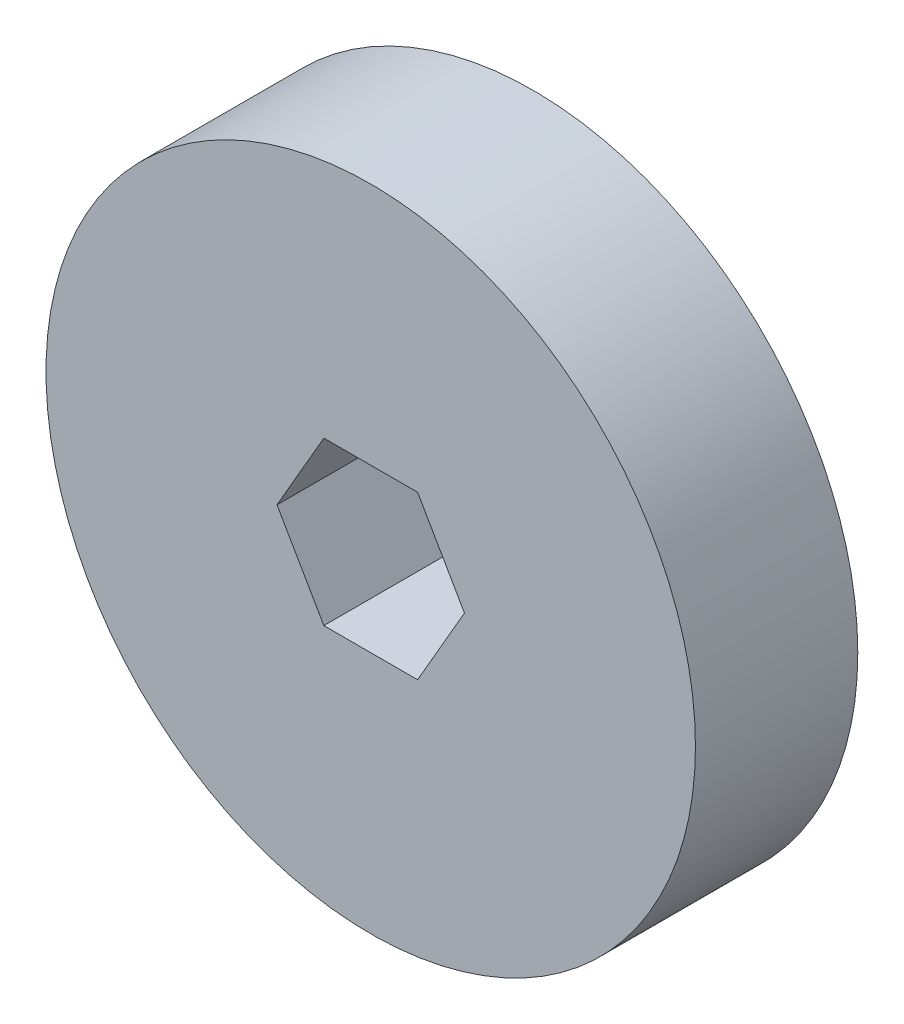
ISO-10303-21;
HEADER;
FILE_DESCRIPTION(('STEP AP214'),'2;1');
FILE_NAME('part.step','',(''),(''),'','','');
FILE_SCHEMA(('AUTOMOTIVE_DESIGN { 1 0 10303 214 1 1 1 1 }'));
ENDSEC;
DATA;
#1=APPLICATION_CONTEXT('core data for automotive mechanical design processes');
#2=APPLICATION_PROTOCOL_DEFINITION('international standard','automotive_design',2000,#1);
#3=PRODUCT_CONTEXT('',#1,'mechanical');
#4=PRODUCT('Part','Part','',(#3));
#5=PRODUCT_RELATED_PRODUCT_CATEGORY('part','',(#4));
#6=PRODUCT_DEFINITION_FORMATION('','',#4);
#7=PRODUCT_DEFINITION_CONTEXT('part definition',#1,'design');
#8=PRODUCT_DEFINITION('design','',#6,#7);
#9=PRODUCT_DEFINITION_SHAPE('','',#8);
#10=(LENGTH_UNIT() NAMED_UNIT(*) SI_UNIT(.MILLI.,.METRE.));
#11=(NAMED_UNIT(*) PLANE_ANGLE_UNIT() SI_UNIT($,.RADIAN.));
#12=(NAMED_UNIT(*) SI_UNIT($,.STERADIAN.) SOLID_ANGLE_UNIT());
#13=UNCERTAINTY_MEASURE_WITH_UNIT(LENGTH_MEASURE(1.E-05),#10,'distance_accuracy_value','');
#14=(GEOMETRIC_REPRESENTATION_CONTEXT(3) GLOBAL_UNCERTAINTY_ASSIGNED_CONTEXT((#13)) GLOBAL_UNIT_ASSIGNED_CONTEXT((#10,
#11,#12)) REPRESENTATION_CONTEXT('',''));
#15=CARTESIAN_POINT('',(0.,0.,0.));
#16=DIRECTION('',(0.,0.,1.));
#17=DIRECTION('',(1.,0.,0.));
#18=AXIS2_PLACEMENT_3D('',#15,#16,#17);
#19=CARTESIAN_POINT('',(0.,0.,12.7));
#20=DIRECTION('',(0.,0.,-1.));
#21=DIRECTION('',(-1.,0.,0.));
#22=AXIS2_PLACEMENT_3D('',#19,#20,#21);
#23=CYLINDRICAL_SURFACE('',#22,25.4);
#24=CARTESIAN_POINT('',(0.,0.,12.7));
#25=DIRECTION('',(0.,0.,1.));
#26=DIRECTION('',(1.,0.,0.));
#27=AXIS2_PLACEMENT_3D('',#24,#25,#26);
#28=CIRCLE('',#27,25.4);
#29=CARTESIAN_POINT('',(25.4,0.,12.7));
#30=VERTEX_POINT('',#29);
#31=EDGE_CURVE('E11',#30,#30,#28,.T.);
#32=ORIENTED_EDGE('',*,*,#31,.F.);
#33=EDGE_LOOP('',(#32));
#34=FACE_BOUND('',#33,.T.);
#35=CARTESIAN_POINT('',(0.,0.,0.));
#36=DIRECTION('',(0.,0.,1.));
#37=DIRECTION('',(1.,0.,0.));
#38=AXIS2_PLACEMENT_3D('',#35,#36,#37);
#39=CIRCLE('',#38,25.4);
#40=CARTESIAN_POINT('',(25.4,0.,0.));
#41=VERTEX_POINT('',#40);
#42=EDGE_CURVE('E50',#41,#41,#39,.T.);
#43=ORIENTED_EDGE('',*,*,#42,.T.);
#44=EDGE_LOOP('',(#43));
#45=FACE_BOUND('',#44,.T.);
#46=ADVANCED_FACE('F47',(#34,#45),#23,.T.);
#47=CARTESIAN_POINT('',(0.,0.,12.7));
#48=DIRECTION('',(0.,0.,1.));
#49=DIRECTION('',(1.,0.,0.));
#50=AXIS2_PLACEMENT_3D('',#47,#48,#49);
#51=PLANE('',#50);
#52=DIRECTION('',(0.5,0.866025403784439,0.));
#53=VECTOR('',#52,1.);
#54=CARTESIAN_POINT('',(3.66617420935412,-6.35,12.7));
#55=LINE('',#54,#53);
#56=CARTESIAN_POINT('',(3.66617420935412,-6.35,12.7));
#57=VERTEX_POINT('',#56);
#58=CARTESIAN_POINT('',(7.33234841870825,0.,12.7));
#59=VERTEX_POINT('',#58);
#60=EDGE_CURVE('E62',#57,#59,#55,.T.);
#61=ORIENTED_EDGE('',*,*,#60,.F.);
#62=DIRECTION('',(1.,0.,0.));
#63=VECTOR('',#62,1.);
#64=CARTESIAN_POINT('',(-3.66617420935412,-6.35,12.7));
#65=LINE('',#64,#63);
#66=CARTESIAN_POINT('',(-3.66617420935412,-6.35,12.7));
#67=VERTEX_POINT('',#66);
#68=EDGE_CURVE('E122',#67,#57,#65,.T.);
#69=ORIENTED_EDGE('',*,*,#68,.F.);
#70=DIRECTION('',(0.5,-0.866025403784439,0.));
#71=VECTOR('',#70,1.);
#72=CARTESIAN_POINT('',(-7.33234841870824,0.,12.7));
#73=LINE('',#72,#71);
#74=CARTESIAN_POINT('',(-7.33234841870824,0.,12.7));
#75=VERTEX_POINT('',#74);
#76=EDGE_CURVE('E126',#75,#67,#73,.T.);
#77=ORIENTED_EDGE('',*,*,#76,.F.);
#78=DIRECTION('',(-0.5,-0.866025403784439,0.));
#79=VECTOR('',#78,1.);
#80=CARTESIAN_POINT('',(-3.66617420935412,6.35,12.7));
#81=LINE('',#80,#79);
#82=CARTESIAN_POINT('',(-3.66617420935412,6.35,12.7));
#83=VERTEX_POINT('',#82);
#84=EDGE_CURVE('E149',#83,#75,#81,.T.);
#85=ORIENTED_EDGE('',*,*,#84,.F.);
#86=DIRECTION('',(-1.,0.,0.));
#87=VECTOR('',#86,1.);
#88=CARTESIAN_POINT('',(3.66617420935412,6.35,12.7));
#89=LINE('',#88,#87);
#90=CARTESIAN_POINT('',(3.66617420935412,6.35,12.7));
#91=VERTEX_POINT('',#90);
#92=EDGE_CURVE('E145',#91,#83,#89,.T.);
#93=ORIENTED_EDGE('',*,*,#92,.F.);
#94=DIRECTION('',(-0.5,0.866025403784439,0.));
#95=VECTOR('',#94,1.);
#96=CARTESIAN_POINT('',(7.33234841870825,0.,12.7));
#97=LINE('',#96,#95);
#98=EDGE_CURVE('E142',#59,#91,#97,.T.);
#99=ORIENTED_EDGE('',*,*,#98,.F.);
#100=EDGE_LOOP('',(#61,#69,#77,#85,#93,#99));
#101=FACE_BOUND('',#100,.T.);
#102=ORIENTED_EDGE('',*,*,#31,.T.);
#103=EDGE_LOOP('',(#102));
#104=FACE_BOUND('',#103,.T.);
#105=ADVANCED_FACE('F173',(#101,#104),#51,.T.);
#106=CARTESIAN_POINT('',(0.,0.,0.));
#107=DIRECTION('',(0.,0.,1.));
#108=DIRECTION('',(1.,0.,0.));
#109=AXIS2_PLACEMENT_3D('',#106,#107,#108);
#110=PLANE('',#109);
#111=DIRECTION('',(1.,0.,0.));
#112=VECTOR('',#111,1.);
#113=CARTESIAN_POINT('',(-3.66617420935412,-6.35,0.));
#114=LINE('',#113,#112);
#115=CARTESIAN_POINT('',(-3.66617420935412,-6.35,0.));
#116=VERTEX_POINT('',#115);
#117=CARTESIAN_POINT('',(3.66617420935412,-6.35,0.));
#118=VERTEX_POINT('',#117);
#119=EDGE_CURVE('E109',#116,#118,#114,.T.);
#120=ORIENTED_EDGE('',*,*,#119,.T.);
#121=DIRECTION('',(0.5,0.866025403784439,0.));
#122=VECTOR('',#121,1.);
#123=CARTESIAN_POINT('',(3.66617420935412,-6.35,0.));
#124=LINE('',#123,#122);
#125=CARTESIAN_POINT('',(7.33234841870825,0.,0.));
#126=VERTEX_POINT('',#125);
#127=EDGE_CURVE('E102',#118,#126,#124,.T.);
#128=ORIENTED_EDGE('',*,*,#127,.T.);
#129=DIRECTION('',(-0.5,0.866025403784439,0.));
#130=VECTOR('',#129,1.);
#131=CARTESIAN_POINT('',(7.33234841870825,0.,0.));
#132=LINE('',#131,#130);
#133=CARTESIAN_POINT('',(3.66617420935413,6.35,0.));
#134=VERTEX_POINT('',#133);
#135=EDGE_CURVE('E112',#126,#134,#132,.T.);
#136=ORIENTED_EDGE('',*,*,#135,.T.);
#137=DIRECTION('',(-1.,0.,0.));
#138=VECTOR('',#137,1.);
#139=CARTESIAN_POINT('',(3.66617420935412,6.35,0.));
#140=LINE('',#139,#138);
#141=CARTESIAN_POINT('',(-3.66617420935412,6.35,0.));
#142=VERTEX_POINT('',#141);
#143=EDGE_CURVE('E70',#134,#142,#140,.T.);
#144=ORIENTED_EDGE('',*,*,#143,.T.);
#145=DIRECTION('',(-0.5,-0.866025403784439,0.));
#146=VECTOR('',#145,1.);
#147=CARTESIAN_POINT('',(-3.66617420935412,6.35,0.));
#148=LINE('',#147,#146);
#149=CARTESIAN_POINT('',(-7.33234841870824,0.,0.));
#150=VERTEX_POINT('',#149);
#151=EDGE_CURVE('E131',#142,#150,#148,.T.);
#152=ORIENTED_EDGE('',*,*,#151,.T.);
#153=DIRECTION('',(0.5,-0.866025403784439,0.));
#154=VECTOR('',#153,1.);
#155=CARTESIAN_POINT('',(-7.33234841870824,0.,0.));
#156=LINE('',#155,#154);
#157=EDGE_CURVE('E135',#150,#116,#156,.T.);
#158=ORIENTED_EDGE('',*,*,#157,.T.);
#159=EDGE_LOOP('',(#120,#128,#136,#144,#152,#158));
#160=FACE_BOUND('',#159,.T.);
#161=ORIENTED_EDGE('',*,*,#42,.F.);
#162=EDGE_LOOP('',(#161));
#163=FACE_BOUND('',#162,.T.);
#164=ADVANCED_FACE('F117',(#160,#163),#110,.F.);
#165=CARTESIAN_POINT('',(3.66617420935412,-6.35,0.));
#166=DIRECTION('',(0.866025403784439,-0.5,0.));
#167=DIRECTION('',(0.5,0.866025403784439,0.));
#168=AXIS2_PLACEMENT_3D('',#165,#166,#167);
#169=PLANE('',#168);
#170=ORIENTED_EDGE('',*,*,#60,.T.);
#171=DIRECTION('',(0.,0.,1.));
#172=VECTOR('',#171,1.);
#173=CARTESIAN_POINT('',(7.33234841870825,0.,0.));
#174=LINE('',#173,#172);
#175=EDGE_CURVE('E98',#126,#59,#174,.T.);
#176=ORIENTED_EDGE('',*,*,#175,.F.);
#177=ORIENTED_EDGE('',*,*,#127,.F.);
#178=DIRECTION('',(0.,0.,1.));
#179=VECTOR('',#178,1.);
#180=CARTESIAN_POINT('',(3.66617420935412,-6.35,0.));
#181=LINE('',#180,#179);
#182=EDGE_CURVE('E156',#118,#57,#181,.T.);
#183=ORIENTED_EDGE('',*,*,#182,.T.);
#184=EDGE_LOOP('',(#170,#176,#177,#183));
#185=FACE_BOUND('',#184,.T.);
#186=ADVANCED_FACE('F100',(#185),#169,.F.);
#187=CARTESIAN_POINT('',(-3.66617420935412,-6.35,0.));
#188=DIRECTION('',(0.,-1.,0.));
#189=DIRECTION('',(0.,0.,-1.));
#190=AXIS2_PLACEMENT_3D('',#187,#188,#189);
#191=PLANE('',#190);
#192=ORIENTED_EDGE('',*,*,#68,.T.);
#193=ORIENTED_EDGE('',*,*,#182,.F.);
#194=ORIENTED_EDGE('',*,*,#119,.F.);
#195=DIRECTION('',(0.,0.,1.));
#196=VECTOR('',#195,1.);
#197=CARTESIAN_POINT('',(-3.66617420935412,-6.35,0.));
#198=LINE('',#197,#196);
#199=EDGE_CURVE('E159',#116,#67,#198,.T.);
#200=ORIENTED_EDGE('',*,*,#199,.T.);
#201=EDGE_LOOP('',(#192,#193,#194,#200));
#202=FACE_BOUND('',#201,.T.);
#203=ADVANCED_FACE('F184',(#202),#191,.F.);
#204=CARTESIAN_POINT('',(-7.33234841870824,0.,0.));
#205=DIRECTION('',(-0.866025403784439,-0.5,0.));
#206=DIRECTION('',(0.5,-0.866025403784439,0.));
#207=AXIS2_PLACEMENT_3D('',#204,#205,#206);
#208=PLANE('',#207);
#209=ORIENTED_EDGE('',*,*,#76,.T.);
#210=ORIENTED_EDGE('',*,*,#199,.F.);
#211=ORIENTED_EDGE('',*,*,#157,.F.);
#212=DIRECTION('',(0.,0.,1.));
#213=VECTOR('',#212,1.);
#214=CARTESIAN_POINT('',(-7.33234841870824,0.,0.));
#215=LINE('',#214,#213);
#216=EDGE_CURVE('E162',#150,#75,#215,.T.);
#217=ORIENTED_EDGE('',*,*,#216,.T.);
#218=EDGE_LOOP('',(#209,#210,#211,#217));
#219=FACE_BOUND('',#218,.T.);
#220=ADVANCED_FACE('F182',(#219),#208,.F.);
#221=CARTESIAN_POINT('',(-3.66617420935412,6.35,0.));
#222=DIRECTION('',(-0.866025403784439,0.5,0.));
#223=DIRECTION('',(-0.5,-0.866025403784439,0.));
#224=AXIS2_PLACEMENT_3D('',#221,#222,#223);
#225=PLANE('',#224);
#226=ORIENTED_EDGE('',*,*,#84,.T.);
#227=ORIENTED_EDGE('',*,*,#216,.F.);
#228=ORIENTED_EDGE('',*,*,#151,.F.);
#229=DIRECTION('',(0.,0.,1.));
#230=VECTOR('',#229,1.);
#231=CARTESIAN_POINT('',(-3.66617420935412,6.35,0.));
#232=LINE('',#231,#230);
#233=EDGE_CURVE('E165',#142,#83,#232,.T.);
#234=ORIENTED_EDGE('',*,*,#233,.T.);
#235=EDGE_LOOP('',(#226,#227,#228,#234));
#236=FACE_BOUND('',#235,.T.);
#237=ADVANCED_FACE('F178',(#236),#225,.F.);
#238=CARTESIAN_POINT('',(3.66617420935412,6.35,0.));
#239=DIRECTION('',(0.,1.,0.));
#240=DIRECTION('',(-1.,0.,0.));
#241=AXIS2_PLACEMENT_3D('',#238,#239,#240);
#242=PLANE('',#241);
#243=ORIENTED_EDGE('',*,*,#92,.T.);
#244=ORIENTED_EDGE('',*,*,#233,.F.);
#245=ORIENTED_EDGE('',*,*,#143,.F.);
#246=DIRECTION('',(0.,0.,1.));
#247=VECTOR('',#246,1.);
#248=CARTESIAN_POINT('',(3.66617420935412,6.35,0.));
#249=LINE('',#248,#247);
#250=EDGE_CURVE('E108',#134,#91,#249,.T.);
#251=ORIENTED_EDGE('',*,*,#250,.T.);
#252=EDGE_LOOP('',(#243,#244,#245,#251));
#253=FACE_BOUND('',#252,.T.);
#254=ADVANCED_FACE('F169',(#253),#242,.F.);
#255=CARTESIAN_POINT('',(7.33234841870825,0.,0.));
#256=DIRECTION('',(0.866025403784439,0.5,0.));
#257=DIRECTION('',(-0.5,0.866025403784439,0.));
#258=AXIS2_PLACEMENT_3D('',#255,#256,#257);
#259=PLANE('',#258);
#260=ORIENTED_EDGE('',*,*,#98,.T.);
#261=ORIENTED_EDGE('',*,*,#250,.F.);
#262=ORIENTED_EDGE('',*,*,#135,.F.);
#263=ORIENTED_EDGE('',*,*,#175,.T.);
#264=EDGE_LOOP('',(#260,#261,#262,#263));
#265=FACE_BOUND('',#264,.T.);
#266=ADVANCED_FACE('F113',(#265),#259,.F.);
#267=CLOSED_SHELL('',(#46,#105,#164,#186,#203,#220,#237,#254,#266));
#268=MANIFOLD_SOLID_BREP('B2',#267);
#269=ADVANCED_BREP_SHAPE_REPRESENTATION('',(#18,#268),#14);
#270=SHAPE_DEFINITION_REPRESENTATION(#9,#269);
ENDSEC;
END-ISO-10303-21;
